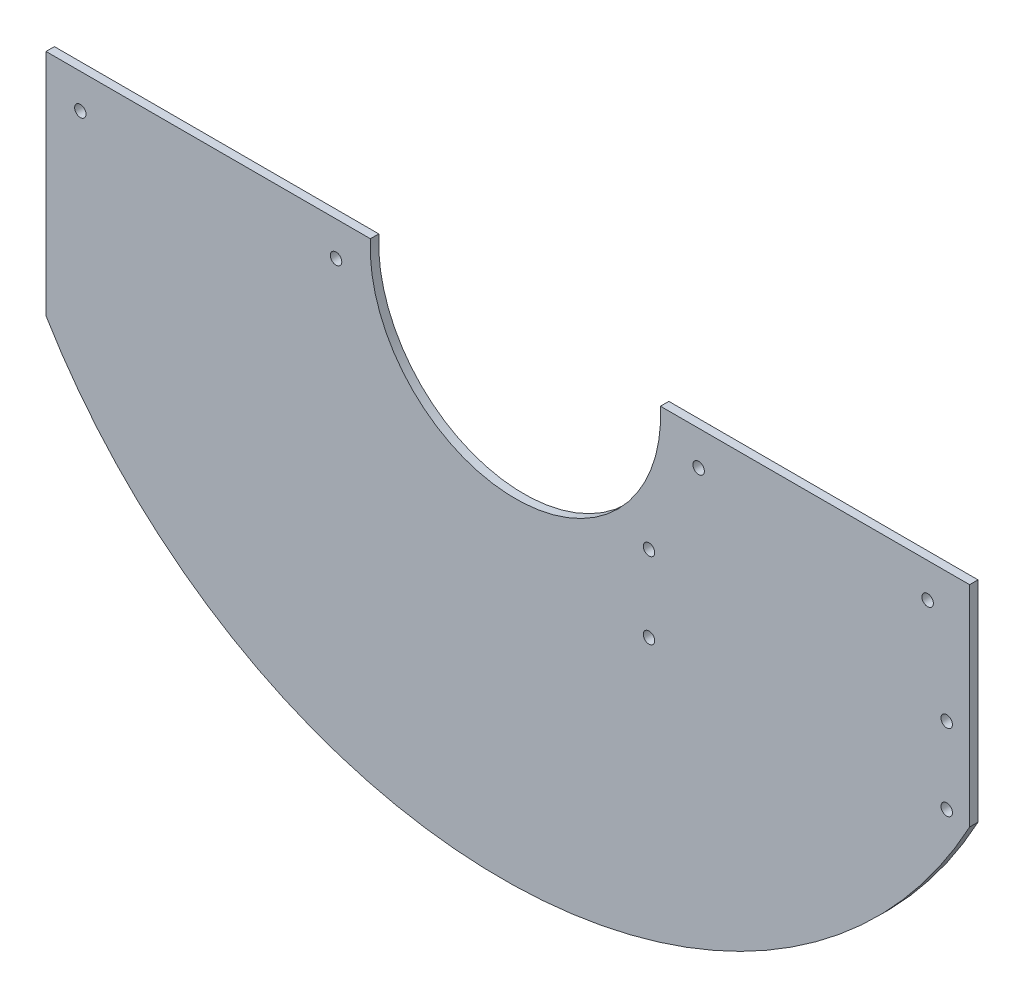
ISO-10303-21;
HEADER;
FILE_DESCRIPTION(('STEP AP214'),'2;1');
FILE_NAME('part.step','',(''),(''),'','','');
FILE_SCHEMA(('AUTOMOTIVE_DESIGN { 1 0 10303 214 1 1 1 1 }'));
ENDSEC;
DATA;
#1=APPLICATION_CONTEXT('core data for automotive mechanical design processes');
#2=APPLICATION_PROTOCOL_DEFINITION('international standard','automotive_design',2000,#1);
#3=PRODUCT_CONTEXT('',#1,'mechanical');
#4=PRODUCT('Part','Part','',(#3));
#5=PRODUCT_RELATED_PRODUCT_CATEGORY('part','',(#4));
#6=PRODUCT_DEFINITION_FORMATION('','',#4);
#7=PRODUCT_DEFINITION_CONTEXT('part definition',#1,'design');
#8=PRODUCT_DEFINITION('design','',#6,#7);
#9=PRODUCT_DEFINITION_SHAPE('','',#8);
#10=(LENGTH_UNIT() NAMED_UNIT(*) SI_UNIT(.MILLI.,.METRE.));
#11=(NAMED_UNIT(*) PLANE_ANGLE_UNIT() SI_UNIT($,.RADIAN.));
#12=(NAMED_UNIT(*) SI_UNIT($,.STERADIAN.) SOLID_ANGLE_UNIT());
#13=UNCERTAINTY_MEASURE_WITH_UNIT(LENGTH_MEASURE(1.E-05),#10,'distance_accuracy_value','');
#14=(GEOMETRIC_REPRESENTATION_CONTEXT(3) GLOBAL_UNCERTAINTY_ASSIGNED_CONTEXT((#13)) GLOBAL_UNIT_ASSIGNED_CONTEXT((#10,
#11,#12)) REPRESENTATION_CONTEXT('',''));
#15=CARTESIAN_POINT('',(0.,0.,0.));
#16=DIRECTION('',(0.,0.,1.));
#17=DIRECTION('',(1.,0.,0.));
#18=AXIS2_PLACEMENT_3D('',#15,#16,#17);
#19=CARTESIAN_POINT('',(120.499999999996,0.,2.2));
#20=DIRECTION('',(-1.,0.,0.));
#21=DIRECTION('',(0.,-1.,0.));
#22=AXIS2_PLACEMENT_3D('',#19,#20,#21);
#23=PLANE('',#22);
#24=DIRECTION('',(0.,1.,0.));
#25=VECTOR('',#24,1.);
#26=CARTESIAN_POINT('',(120.499999999996,0.,0.));
#27=LINE('',#26,#25);
#28=CARTESIAN_POINT('',(120.5,-55.,0.));
#29=VERTEX_POINT('',#28);
#30=CARTESIAN_POINT('',(120.499999999996,0.,0.));
#31=VERTEX_POINT('',#30);
#32=EDGE_CURVE('E123',#29,#31,#27,.T.);
#33=ORIENTED_EDGE('',*,*,#32,.T.);
#34=DIRECTION('',(0.,0.,-1.));
#35=VECTOR('',#34,1.);
#36=CARTESIAN_POINT('',(120.499999999996,0.,2.2));
#37=LINE('',#36,#35);
#38=CARTESIAN_POINT('',(120.499999999996,0.,2.2));
#39=VERTEX_POINT('',#38);
#40=EDGE_CURVE('E11',#39,#31,#37,.T.);
#41=ORIENTED_EDGE('',*,*,#40,.F.);
#42=DIRECTION('',(0.,1.,0.));
#43=VECTOR('',#42,1.);
#44=CARTESIAN_POINT('',(120.499999999996,0.,2.2));
#45=LINE('',#44,#43);
#46=CARTESIAN_POINT('',(120.5,-55.,2.2));
#47=VERTEX_POINT('',#46);
#48=EDGE_CURVE('E134',#47,#39,#45,.T.);
#49=ORIENTED_EDGE('',*,*,#48,.F.);
#50=DIRECTION('',(0.,0.,-1.));
#51=VECTOR('',#50,1.);
#52=CARTESIAN_POINT('',(120.5,-55.,2.2));
#53=LINE('',#52,#51);
#54=EDGE_CURVE('E119',#47,#29,#53,.T.);
#55=ORIENTED_EDGE('',*,*,#54,.T.);
#56=EDGE_LOOP('',(#33,#41,#49,#55));
#57=FACE_BOUND('',#56,.T.);
#58=ADVANCED_FACE('F39',(#57),#23,.F.);
#59=CARTESIAN_POINT('',(120.499999999996,0.,2.2));
#60=DIRECTION('',(0.,-1.,0.));
#61=DIRECTION('',(1.,0.,0.));
#62=AXIS2_PLACEMENT_3D('',#59,#60,#61);
#63=PLANE('',#62);
#64=DIRECTION('',(-1.,0.,0.));
#65=VECTOR('',#64,1.);
#66=CARTESIAN_POINT('',(120.499999999996,0.,0.));
#67=LINE('',#66,#65);
#68=CARTESIAN_POINT('',(39.5,0.,0.));
#69=VERTEX_POINT('',#68);
#70=EDGE_CURVE('E126',#31,#69,#67,.T.);
#71=ORIENTED_EDGE('',*,*,#70,.T.);
#72=DIRECTION('',(0.,0.,-1.));
#73=VECTOR('',#72,1.);
#74=CARTESIAN_POINT('',(39.5,0.,2.2));
#75=LINE('',#74,#73);
#76=CARTESIAN_POINT('',(39.5,0.,2.2));
#77=VERTEX_POINT('',#76);
#78=EDGE_CURVE('E47',#77,#69,#75,.T.);
#79=ORIENTED_EDGE('',*,*,#78,.F.);
#80=DIRECTION('',(-1.,0.,0.));
#81=VECTOR('',#80,1.);
#82=CARTESIAN_POINT('',(120.499999999996,0.,2.2));
#83=LINE('',#82,#81);
#84=EDGE_CURVE('E92',#39,#77,#83,.T.);
#85=ORIENTED_EDGE('',*,*,#84,.F.);
#86=ORIENTED_EDGE('',*,*,#40,.T.);
#87=EDGE_LOOP('',(#71,#79,#85,#86));
#88=FACE_BOUND('',#87,.T.);
#89=ADVANCED_FACE('F160',(#88),#63,.F.);
#90=CARTESIAN_POINT('',(1.5,-1.95000000000001,2.2));
#91=DIRECTION('',(0.,0.,-1.));
#92=DIRECTION('',(-1.,0.,0.));
#93=AXIS2_PLACEMENT_3D('',#90,#91,#92);
#94=CYLINDRICAL_SURFACE('',#93,38.05);
#95=CARTESIAN_POINT('',(1.5,-1.95000000000001,0.));
#96=DIRECTION('',(0.,0.,-1.));
#97=DIRECTION('',(1.,0.,0.));
#98=AXIS2_PLACEMENT_3D('',#95,#96,#97);
#99=CIRCLE('',#98,38.05);
#100=CARTESIAN_POINT('',(-36.5,0.,0.));
#101=VERTEX_POINT('',#100);
#102=EDGE_CURVE('E129',#69,#101,#99,.T.);
#103=ORIENTED_EDGE('',*,*,#102,.T.);
#104=DIRECTION('',(0.,0.,-1.));
#105=VECTOR('',#104,1.);
#106=CARTESIAN_POINT('',(-36.5,0.,2.2));
#107=LINE('',#106,#105);
#108=CARTESIAN_POINT('',(-36.5,0.,2.2));
#109=VERTEX_POINT('',#108);
#110=EDGE_CURVE('E114',#109,#101,#107,.T.);
#111=ORIENTED_EDGE('',*,*,#110,.F.);
#112=CARTESIAN_POINT('',(1.5,-1.95000000000001,2.2));
#113=DIRECTION('',(0.,0.,-1.));
#114=DIRECTION('',(1.,0.,0.));
#115=AXIS2_PLACEMENT_3D('',#112,#113,#114);
#116=CIRCLE('',#115,38.05);
#117=EDGE_CURVE('E105',#77,#109,#116,.T.);
#118=ORIENTED_EDGE('',*,*,#117,.F.);
#119=ORIENTED_EDGE('',*,*,#78,.T.);
#120=EDGE_LOOP('',(#103,#111,#118,#119));
#121=FACE_BOUND('',#120,.T.);
#122=ADVANCED_FACE('F140',(#121),#94,.F.);
#123=CARTESIAN_POINT('',(-121.5,0.,2.2));
#124=DIRECTION('',(0.,-1.,0.));
#125=DIRECTION('',(0.,0.,-1.));
#126=AXIS2_PLACEMENT_3D('',#123,#124,#125);
#127=PLANE('',#126);
#128=DIRECTION('',(-1.,0.,0.));
#129=VECTOR('',#128,1.);
#130=CARTESIAN_POINT('',(-121.5,0.,0.));
#131=LINE('',#130,#129);
#132=CARTESIAN_POINT('',(-121.5,0.,0.));
#133=VERTEX_POINT('',#132);
#134=EDGE_CURVE('E113',#101,#133,#131,.T.);
#135=ORIENTED_EDGE('',*,*,#134,.T.);
#136=DIRECTION('',(0.,0.,-1.));
#137=VECTOR('',#136,1.);
#138=CARTESIAN_POINT('',(-121.5,0.,2.2));
#139=LINE('',#138,#137);
#140=CARTESIAN_POINT('',(-121.5,0.,2.2));
#141=VERTEX_POINT('',#140);
#142=EDGE_CURVE('E110',#141,#133,#139,.T.);
#143=ORIENTED_EDGE('',*,*,#142,.F.);
#144=DIRECTION('',(-1.,0.,0.));
#145=VECTOR('',#144,1.);
#146=CARTESIAN_POINT('',(-121.5,0.,2.2));
#147=LINE('',#146,#145);
#148=EDGE_CURVE('E99',#109,#141,#147,.T.);
#149=ORIENTED_EDGE('',*,*,#148,.F.);
#150=ORIENTED_EDGE('',*,*,#110,.T.);
#151=EDGE_LOOP('',(#135,#143,#149,#150));
#152=FACE_BOUND('',#151,.T.);
#153=ADVANCED_FACE('F111',(#152),#127,.F.);
#154=CARTESIAN_POINT('',(-121.5,0.,2.2));
#155=DIRECTION('',(1.,0.,0.));
#156=DIRECTION('',(0.,0.,-1.));
#157=AXIS2_PLACEMENT_3D('',#154,#155,#156);
#158=PLANE('',#157);
#159=DIRECTION('',(0.,-1.,0.));
#160=VECTOR('',#159,1.);
#161=CARTESIAN_POINT('',(-121.5,0.,0.));
#162=LINE('',#161,#160);
#163=CARTESIAN_POINT('',(-121.5,-60.,0.));
#164=VERTEX_POINT('',#163);
#165=EDGE_CURVE('E78',#133,#164,#162,.T.);
#166=ORIENTED_EDGE('',*,*,#165,.T.);
#167=DIRECTION('',(0.,0.,-1.));
#168=VECTOR('',#167,1.);
#169=CARTESIAN_POINT('',(-121.5,-60.,2.2));
#170=LINE('',#169,#168);
#171=CARTESIAN_POINT('',(-121.5,-60.,2.2));
#172=VERTEX_POINT('',#171);
#173=EDGE_CURVE('E115',#172,#164,#170,.T.);
#174=ORIENTED_EDGE('',*,*,#173,.F.);
#175=DIRECTION('',(0.,-1.,0.));
#176=VECTOR('',#175,1.);
#177=CARTESIAN_POINT('',(-121.5,0.,2.2));
#178=LINE('',#177,#176);
#179=EDGE_CURVE('E103',#141,#172,#178,.T.);
#180=ORIENTED_EDGE('',*,*,#179,.F.);
#181=ORIENTED_EDGE('',*,*,#142,.T.);
#182=EDGE_LOOP('',(#166,#174,#180,#181));
#183=FACE_BOUND('',#182,.T.);
#184=ADVANCED_FACE('F117',(#183),#158,.F.);
#185=CARTESIAN_POINT('',(-1.91829487725759,11.1454720592673,2.2));
#186=DIRECTION('',(0.,0.,-1.));
#187=DIRECTION('',(-1.,0.,0.));
#188=AXIS2_PLACEMENT_3D('',#185,#186,#187);
#189=CYLINDRICAL_SURFACE('',#188,139.145472059275);
#190=CARTESIAN_POINT('',(-1.91829487725759,11.1454720592673,0.));
#191=DIRECTION('',(0.,0.,1.));
#192=DIRECTION('',(1.,0.,0.));
#193=AXIS2_PLACEMENT_3D('',#190,#191,#192);
#194=CIRCLE('',#193,139.145472059275);
#195=EDGE_CURVE('E84',#164,#29,#194,.T.);
#196=ORIENTED_EDGE('',*,*,#195,.T.);
#197=ORIENTED_EDGE('',*,*,#54,.F.);
#198=CARTESIAN_POINT('',(-1.91829487725759,11.1454720592673,2.2));
#199=DIRECTION('',(0.,0.,1.));
#200=DIRECTION('',(1.,0.,0.));
#201=AXIS2_PLACEMENT_3D('',#198,#199,#200);
#202=CIRCLE('',#201,139.145472059275);
#203=EDGE_CURVE('E55',#172,#47,#202,.T.);
#204=ORIENTED_EDGE('',*,*,#203,.F.);
#205=ORIENTED_EDGE('',*,*,#173,.T.);
#206=EDGE_LOOP('',(#196,#197,#204,#205));
#207=FACE_BOUND('',#206,.T.);
#208=ADVANCED_FACE('F147',(#207),#189,.T.);
#209=CARTESIAN_POINT('',(-1.91829487725759,11.1454720592673,2.2));
#210=DIRECTION('',(0.,0.,1.));
#211=DIRECTION('',(1.,0.,0.));
#212=AXIS2_PLACEMENT_3D('',#209,#210,#211);
#213=PLANE('',#212);
#214=CARTESIAN_POINT('',(114.499999999996,-54.,2.2));
#215=DIRECTION('',(0.,0.,1.));
#216=DIRECTION('',(1.,0.,0.));
#217=AXIS2_PLACEMENT_3D('',#214,#215,#216);
#218=CIRCLE('',#217,1.5);
#219=CARTESIAN_POINT('',(115.999999999996,-54.,2.2));
#220=VERTEX_POINT('',#219);
#221=EDGE_CURVE('E283',#220,#220,#218,.T.);
#222=ORIENTED_EDGE('',*,*,#221,.F.);
#223=EDGE_LOOP('',(#222));
#224=FACE_BOUND('',#223,.T.);
#225=CARTESIAN_POINT('',(36.4999999999964,-34.,2.2));
#226=DIRECTION('',(0.,0.,1.));
#227=DIRECTION('',(1.,0.,0.));
#228=AXIS2_PLACEMENT_3D('',#225,#226,#227);
#229=CIRCLE('',#228,1.5);
#230=CARTESIAN_POINT('',(37.9999999999964,-34.,2.2));
#231=VERTEX_POINT('',#230);
#232=EDGE_CURVE('E287',#231,#231,#229,.T.);
#233=ORIENTED_EDGE('',*,*,#232,.F.);
#234=EDGE_LOOP('',(#233));
#235=FACE_BOUND('',#234,.T.);
#236=CARTESIAN_POINT('',(36.4999999999964,-54.,2.2));
#237=DIRECTION('',(0.,0.,1.));
#238=DIRECTION('',(1.,0.,0.));
#239=AXIS2_PLACEMENT_3D('',#236,#237,#238);
#240=CIRCLE('',#239,1.5);
#241=CARTESIAN_POINT('',(37.9999999999964,-54.,2.2));
#242=VERTEX_POINT('',#241);
#243=EDGE_CURVE('E295',#242,#242,#240,.T.);
#244=ORIENTED_EDGE('',*,*,#243,.F.);
#245=EDGE_LOOP('',(#244));
#246=FACE_BOUND('',#245,.T.);
#247=CARTESIAN_POINT('',(114.499999999996,-34.,2.2));
#248=DIRECTION('',(0.,0.,1.));
#249=DIRECTION('',(1.,0.,0.));
#250=AXIS2_PLACEMENT_3D('',#247,#248,#249);
#251=CIRCLE('',#250,1.5);
#252=CARTESIAN_POINT('',(115.999999999996,-34.,2.2));
#253=VERTEX_POINT('',#252);
#254=EDGE_CURVE('E289',#253,#253,#251,.T.);
#255=ORIENTED_EDGE('',*,*,#254,.F.);
#256=EDGE_LOOP('',(#255));
#257=FACE_BOUND('',#256,.T.);
#258=CARTESIAN_POINT('',(109.5,-9.,2.2));
#259=DIRECTION('',(0.,0.,1.));
#260=DIRECTION('',(1.,0.,0.));
#261=AXIS2_PLACEMENT_3D('',#258,#259,#260);
#262=CIRCLE('',#261,1.5);
#263=CARTESIAN_POINT('',(111.,-9.,2.2));
#264=VERTEX_POINT('',#263);
#265=EDGE_CURVE('E306',#264,#264,#262,.T.);
#266=ORIENTED_EDGE('',*,*,#265,.F.);
#267=EDGE_LOOP('',(#266));
#268=FACE_BOUND('',#267,.T.);
#269=CARTESIAN_POINT('',(49.5,-9.,2.2));
#270=DIRECTION('',(0.,0.,1.));
#271=DIRECTION('',(1.,0.,0.));
#272=AXIS2_PLACEMENT_3D('',#269,#270,#271);
#273=CIRCLE('',#272,1.5);
#274=CARTESIAN_POINT('',(51.,-9.,2.2));
#275=VERTEX_POINT('',#274);
#276=EDGE_CURVE('E309',#275,#275,#273,.T.);
#277=ORIENTED_EDGE('',*,*,#276,.F.);
#278=EDGE_LOOP('',(#277));
#279=FACE_BOUND('',#278,.T.);
#280=CARTESIAN_POINT('',(-45.5,-9.,2.2));
#281=DIRECTION('',(0.,0.,1.));
#282=DIRECTION('',(1.,0.,0.));
#283=AXIS2_PLACEMENT_3D('',#280,#281,#282);
#284=CIRCLE('',#283,1.5);
#285=CARTESIAN_POINT('',(-44.,-9.,2.2));
#286=VERTEX_POINT('',#285);
#287=EDGE_CURVE('E315',#286,#286,#284,.T.);
#288=ORIENTED_EDGE('',*,*,#287,.F.);
#289=EDGE_LOOP('',(#288));
#290=FACE_BOUND('',#289,.T.);
#291=CARTESIAN_POINT('',(-112.5,-9.,2.2));
#292=DIRECTION('',(0.,0.,1.));
#293=DIRECTION('',(1.,0.,0.));
#294=AXIS2_PLACEMENT_3D('',#291,#292,#293);
#295=CIRCLE('',#294,1.5);
#296=CARTESIAN_POINT('',(-111.,-9.,2.2));
#297=VERTEX_POINT('',#296);
#298=EDGE_CURVE('E321',#297,#297,#295,.T.);
#299=ORIENTED_EDGE('',*,*,#298,.F.);
#300=EDGE_LOOP('',(#299));
#301=FACE_BOUND('',#300,.T.);
#302=ORIENTED_EDGE('',*,*,#48,.T.);
#303=ORIENTED_EDGE('',*,*,#84,.T.);
#304=ORIENTED_EDGE('',*,*,#117,.T.);
#305=ORIENTED_EDGE('',*,*,#148,.T.);
#306=ORIENTED_EDGE('',*,*,#179,.T.);
#307=ORIENTED_EDGE('',*,*,#203,.T.);
#308=EDGE_LOOP('',(#302,#303,#304,#305,#306,#307));
#309=FACE_BOUND('',#308,.T.);
#310=ADVANCED_FACE('F101',(#224,#235,#246,#257,#268,#279,#290,#301,#309),#213,.T.);
#311=CARTESIAN_POINT('',(-1.91829487725759,11.1454720592673,0.));
#312=DIRECTION('',(0.,0.,1.));
#313=DIRECTION('',(1.,0.,0.));
#314=AXIS2_PLACEMENT_3D('',#311,#312,#313);
#315=PLANE('',#314);
#316=CARTESIAN_POINT('',(114.499999999996,-54.,0.));
#317=DIRECTION('',(0.,0.,1.));
#318=DIRECTION('',(1.,0.,0.));
#319=AXIS2_PLACEMENT_3D('',#316,#317,#318);
#320=CIRCLE('',#319,1.5);
#321=CARTESIAN_POINT('',(115.999999999996,-54.,0.));
#322=VERTEX_POINT('',#321);
#323=EDGE_CURVE('E286',#322,#322,#320,.F.);
#324=ORIENTED_EDGE('',*,*,#323,.F.);
#325=EDGE_LOOP('',(#324));
#326=FACE_BOUND('',#325,.T.);
#327=CARTESIAN_POINT('',(36.4999999999964,-34.,0.));
#328=DIRECTION('',(0.,0.,1.));
#329=DIRECTION('',(1.,0.,0.));
#330=AXIS2_PLACEMENT_3D('',#327,#328,#329);
#331=CIRCLE('',#330,1.5);
#332=CARTESIAN_POINT('',(37.9999999999964,-34.,0.));
#333=VERTEX_POINT('',#332);
#334=EDGE_CURVE('E292',#333,#333,#331,.F.);
#335=ORIENTED_EDGE('',*,*,#334,.F.);
#336=EDGE_LOOP('',(#335));
#337=FACE_BOUND('',#336,.T.);
#338=CARTESIAN_POINT('',(36.4999999999964,-54.,0.));
#339=DIRECTION('',(0.,0.,1.));
#340=DIRECTION('',(1.,0.,0.));
#341=AXIS2_PLACEMENT_3D('',#338,#339,#340);
#342=CIRCLE('',#341,1.5);
#343=CARTESIAN_POINT('',(37.9999999999964,-54.,0.));
#344=VERTEX_POINT('',#343);
#345=EDGE_CURVE('E357',#344,#344,#342,.F.);
#346=ORIENTED_EDGE('',*,*,#345,.F.);
#347=EDGE_LOOP('',(#346));
#348=FACE_BOUND('',#347,.T.);
#349=CARTESIAN_POINT('',(114.499999999996,-34.,0.));
#350=DIRECTION('',(0.,0.,1.));
#351=DIRECTION('',(1.,0.,0.));
#352=AXIS2_PLACEMENT_3D('',#349,#350,#351);
#353=CIRCLE('',#352,1.5);
#354=CARTESIAN_POINT('',(115.999999999996,-34.,0.));
#355=VERTEX_POINT('',#354);
#356=EDGE_CURVE('E302',#355,#355,#353,.F.);
#357=ORIENTED_EDGE('',*,*,#356,.F.);
#358=EDGE_LOOP('',(#357));
#359=FACE_BOUND('',#358,.T.);
#360=CARTESIAN_POINT('',(109.5,-9.,0.));
#361=DIRECTION('',(0.,0.,1.));
#362=DIRECTION('',(1.,0.,0.));
#363=AXIS2_PLACEMENT_3D('',#360,#361,#362);
#364=CIRCLE('',#363,1.5);
#365=CARTESIAN_POINT('',(111.,-9.,0.));
#366=VERTEX_POINT('',#365);
#367=EDGE_CURVE('E127',#366,#366,#364,.F.);
#368=ORIENTED_EDGE('',*,*,#367,.F.);
#369=EDGE_LOOP('',(#368));
#370=FACE_BOUND('',#369,.T.);
#371=CARTESIAN_POINT('',(49.5,-9.,0.));
#372=DIRECTION('',(0.,0.,1.));
#373=DIRECTION('',(1.,0.,0.));
#374=AXIS2_PLACEMENT_3D('',#371,#372,#373);
#375=CIRCLE('',#374,1.5);
#376=CARTESIAN_POINT('',(51.,-9.,0.));
#377=VERTEX_POINT('',#376);
#378=EDGE_CURVE('E312',#377,#377,#375,.F.);
#379=ORIENTED_EDGE('',*,*,#378,.F.);
#380=EDGE_LOOP('',(#379));
#381=FACE_BOUND('',#380,.T.);
#382=CARTESIAN_POINT('',(-45.5,-9.,0.));
#383=DIRECTION('',(0.,0.,1.));
#384=DIRECTION('',(1.,0.,0.));
#385=AXIS2_PLACEMENT_3D('',#382,#383,#384);
#386=CIRCLE('',#385,1.5);
#387=CARTESIAN_POINT('',(-44.,-9.,0.));
#388=VERTEX_POINT('',#387);
#389=EDGE_CURVE('E318',#388,#388,#386,.F.);
#390=ORIENTED_EDGE('',*,*,#389,.F.);
#391=EDGE_LOOP('',(#390));
#392=FACE_BOUND('',#391,.T.);
#393=CARTESIAN_POINT('',(-112.5,-9.,0.));
#394=DIRECTION('',(0.,0.,1.));
#395=DIRECTION('',(1.,0.,0.));
#396=AXIS2_PLACEMENT_3D('',#393,#394,#395);
#397=CIRCLE('',#396,1.5);
#398=CARTESIAN_POINT('',(-111.,-9.,0.));
#399=VERTEX_POINT('',#398);
#400=EDGE_CURVE('E305',#399,#399,#397,.F.);
#401=ORIENTED_EDGE('',*,*,#400,.F.);
#402=EDGE_LOOP('',(#401));
#403=FACE_BOUND('',#402,.T.);
#404=ORIENTED_EDGE('',*,*,#32,.F.);
#405=ORIENTED_EDGE('',*,*,#195,.F.);
#406=ORIENTED_EDGE('',*,*,#165,.F.);
#407=ORIENTED_EDGE('',*,*,#134,.F.);
#408=ORIENTED_EDGE('',*,*,#102,.F.);
#409=ORIENTED_EDGE('',*,*,#70,.F.);
#410=EDGE_LOOP('',(#404,#405,#406,#407,#408,#409));
#411=FACE_BOUND('',#410,.T.);
#412=ADVANCED_FACE('F143',(#326,#337,#348,#359,#370,#381,#392,#403,#411),#315,.F.);
#413=CARTESIAN_POINT('',(-112.5,-9.,-0.00100000000000013));
#414=DIRECTION('',(0.,0.,1.));
#415=DIRECTION('',(1.,0.,0.));
#416=AXIS2_PLACEMENT_3D('',#413,#414,#415);
#417=CYLINDRICAL_SURFACE('',#416,1.5);
#418=ORIENTED_EDGE('',*,*,#298,.T.);
#419=EDGE_LOOP('',(#418));
#420=FACE_BOUND('',#419,.T.);
#421=ORIENTED_EDGE('',*,*,#400,.T.);
#422=EDGE_LOOP('',(#421));
#423=FACE_BOUND('',#422,.T.);
#424=ADVANCED_FACE('F200',(#420,#423),#417,.F.);
#425=CARTESIAN_POINT('',(-45.5,-9.,-0.00100000000000013));
#426=DIRECTION('',(0.,0.,1.));
#427=DIRECTION('',(1.,0.,0.));
#428=AXIS2_PLACEMENT_3D('',#425,#426,#427);
#429=CYLINDRICAL_SURFACE('',#428,1.5);
#430=ORIENTED_EDGE('',*,*,#287,.T.);
#431=EDGE_LOOP('',(#430));
#432=FACE_BOUND('',#431,.T.);
#433=ORIENTED_EDGE('',*,*,#389,.T.);
#434=EDGE_LOOP('',(#433));
#435=FACE_BOUND('',#434,.T.);
#436=ADVANCED_FACE('F209',(#432,#435),#429,.F.);
#437=CARTESIAN_POINT('',(49.5,-9.,-0.00100000000000013));
#438=DIRECTION('',(0.,0.,1.));
#439=DIRECTION('',(1.,0.,0.));
#440=AXIS2_PLACEMENT_3D('',#437,#438,#439);
#441=CYLINDRICAL_SURFACE('',#440,1.5);
#442=ORIENTED_EDGE('',*,*,#276,.T.);
#443=EDGE_LOOP('',(#442));
#444=FACE_BOUND('',#443,.T.);
#445=ORIENTED_EDGE('',*,*,#378,.T.);
#446=EDGE_LOOP('',(#445));
#447=FACE_BOUND('',#446,.T.);
#448=ADVANCED_FACE('F219',(#444,#447),#441,.F.);
#449=CARTESIAN_POINT('',(109.5,-9.,-0.00100000000000013));
#450=DIRECTION('',(0.,0.,1.));
#451=DIRECTION('',(1.,0.,0.));
#452=AXIS2_PLACEMENT_3D('',#449,#450,#451);
#453=CYLINDRICAL_SURFACE('',#452,1.5);
#454=ORIENTED_EDGE('',*,*,#265,.T.);
#455=EDGE_LOOP('',(#454));
#456=FACE_BOUND('',#455,.T.);
#457=ORIENTED_EDGE('',*,*,#367,.T.);
#458=EDGE_LOOP('',(#457));
#459=FACE_BOUND('',#458,.T.);
#460=ADVANCED_FACE('F229',(#456,#459),#453,.F.);
#461=CARTESIAN_POINT('',(114.499999999996,-34.,-0.00100000000000013));
#462=DIRECTION('',(0.,0.,1.));
#463=DIRECTION('',(1.,0.,0.));
#464=AXIS2_PLACEMENT_3D('',#461,#462,#463);
#465=CYLINDRICAL_SURFACE('',#464,1.5);
#466=ORIENTED_EDGE('',*,*,#254,.T.);
#467=EDGE_LOOP('',(#466));
#468=FACE_BOUND('',#467,.T.);
#469=ORIENTED_EDGE('',*,*,#356,.T.);
#470=EDGE_LOOP('',(#469));
#471=FACE_BOUND('',#470,.T.);
#472=ADVANCED_FACE('F238',(#468,#471),#465,.F.);
#473=CARTESIAN_POINT('',(36.4999999999964,-54.,-0.00100000000000013));
#474=DIRECTION('',(0.,0.,1.));
#475=DIRECTION('',(1.,0.,0.));
#476=AXIS2_PLACEMENT_3D('',#473,#474,#475);
#477=CYLINDRICAL_SURFACE('',#476,1.5);
#478=ORIENTED_EDGE('',*,*,#243,.T.);
#479=EDGE_LOOP('',(#478));
#480=FACE_BOUND('',#479,.T.);
#481=ORIENTED_EDGE('',*,*,#345,.T.);
#482=EDGE_LOOP('',(#481));
#483=FACE_BOUND('',#482,.T.);
#484=ADVANCED_FACE('F247',(#480,#483),#477,.F.);
#485=CARTESIAN_POINT('',(36.4999999999964,-34.,-0.00100000000000013));
#486=DIRECTION('',(0.,0.,1.));
#487=DIRECTION('',(1.,0.,0.));
#488=AXIS2_PLACEMENT_3D('',#485,#486,#487);
#489=CYLINDRICAL_SURFACE('',#488,1.5);
#490=ORIENTED_EDGE('',*,*,#232,.T.);
#491=EDGE_LOOP('',(#490));
#492=FACE_BOUND('',#491,.T.);
#493=ORIENTED_EDGE('',*,*,#334,.T.);
#494=EDGE_LOOP('',(#493));
#495=FACE_BOUND('',#494,.T.);
#496=ADVANCED_FACE('F257',(#492,#495),#489,.F.);
#497=CARTESIAN_POINT('',(114.499999999996,-54.,-0.00100000000000013));
#498=DIRECTION('',(0.,0.,1.));
#499=DIRECTION('',(1.,0.,0.));
#500=AXIS2_PLACEMENT_3D('',#497,#498,#499);
#501=CYLINDRICAL_SURFACE('',#500,1.5);
#502=ORIENTED_EDGE('',*,*,#221,.T.);
#503=EDGE_LOOP('',(#502));
#504=FACE_BOUND('',#503,.T.);
#505=ORIENTED_EDGE('',*,*,#323,.T.);
#506=EDGE_LOOP('',(#505));
#507=FACE_BOUND('',#506,.T.);
#508=ADVANCED_FACE('F267',(#504,#507),#501,.F.);
#509=CLOSED_SHELL('',(#58,#89,#122,#153,#184,#208,#310,#412,#424,#436,#448,#460,#472,#484,#496,#508));
#510=MANIFOLD_SOLID_BREP('B2',#509);
#511=ADVANCED_BREP_SHAPE_REPRESENTATION('',(#18,#510),#14);
#512=SHAPE_DEFINITION_REPRESENTATION(#9,#511);
ENDSEC;
END-ISO-10303-21;
